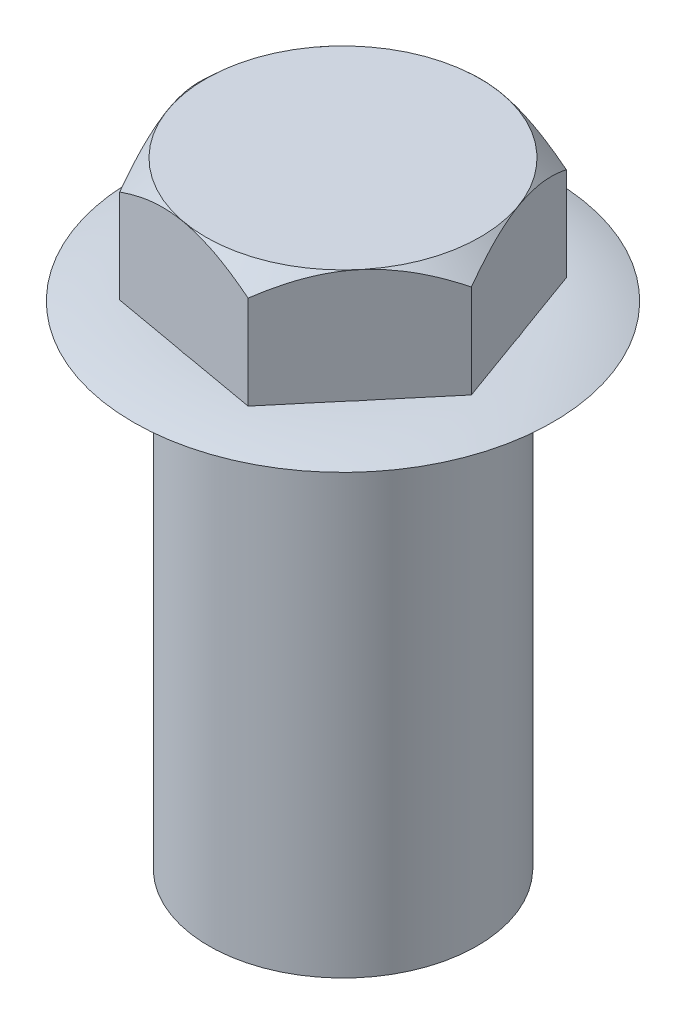
ISO-10303-21;
HEADER;
FILE_DESCRIPTION(('STEP AP214'),'2;1');
FILE_NAME('part.step','',(''),(''),'','','');
FILE_SCHEMA(('AUTOMOTIVE_DESIGN { 1 0 10303 214 1 1 1 1 }'));
ENDSEC;
DATA;
#1=APPLICATION_CONTEXT('core data for automotive mechanical design processes');
#2=APPLICATION_PROTOCOL_DEFINITION('international standard','automotive_design',2000,#1);
#3=PRODUCT_CONTEXT('',#1,'mechanical');
#4=PRODUCT('Part','Part','',(#3));
#5=PRODUCT_RELATED_PRODUCT_CATEGORY('part','',(#4));
#6=PRODUCT_DEFINITION_FORMATION('','',#4);
#7=PRODUCT_DEFINITION_CONTEXT('part definition',#1,'design');
#8=PRODUCT_DEFINITION('design','',#6,#7);
#9=PRODUCT_DEFINITION_SHAPE('','',#8);
#10=(LENGTH_UNIT() NAMED_UNIT(*) SI_UNIT(.MILLI.,.METRE.));
#11=(NAMED_UNIT(*) PLANE_ANGLE_UNIT() SI_UNIT($,.RADIAN.));
#12=(NAMED_UNIT(*) SI_UNIT($,.STERADIAN.) SOLID_ANGLE_UNIT());
#13=UNCERTAINTY_MEASURE_WITH_UNIT(LENGTH_MEASURE(1.E-05),#10,'distance_accuracy_value','');
#14=(GEOMETRIC_REPRESENTATION_CONTEXT(3) GLOBAL_UNCERTAINTY_ASSIGNED_CONTEXT((#13)) GLOBAL_UNIT_ASSIGNED_CONTEXT((#10,
#11,#12)) REPRESENTATION_CONTEXT('',''));
#15=CARTESIAN_POINT('',(0.,0.,0.));
#16=DIRECTION('',(0.,0.,1.));
#17=DIRECTION('',(1.,0.,0.));
#18=AXIS2_PLACEMENT_3D('',#15,#16,#17);
#19=CARTESIAN_POINT('',(0.,3.67723366511614,0.));
#20=DIRECTION('',(0.,-1.,0.));
#21=DIRECTION('',(0.,0.,-1.));
#22=AXIS2_PLACEMENT_3D('',#19,#20,#21);
#23=DEGENERATE_TOROIDAL_SURFACE('',#22,1.87323034856653,2.96330867200839,.T.);
#24=CARTESIAN_POINT('',(0.,6.5,0.));
#25=DIRECTION('',(0.,-1.,0.));
#26=DIRECTION('',(0.,0.,-1.));
#27=AXIS2_PLACEMENT_3D('',#24,#25,#26);
#28=CIRCLE('',#27,2.775);
#29=CARTESIAN_POINT('',(0.,6.5,-2.775));
#30=VERTEX_POINT('',#29);
#31=EDGE_CURVE('E549',#30,#30,#28,.T.);
#32=ORIENTED_EDGE('',*,*,#31,.F.);
#33=EDGE_LOOP('',(#32));
#34=FACE_BOUND('',#33,.T.);
#35=CARTESIAN_POINT('',(1.92782300433998,6.64003894318649,-0.00996338560430932));
#36=DIRECTION('',(-0.341052769256886,0.,-0.940044152464239));
#37=VECTOR('',#36,1.);
#38=LINE('',#35,#37);
#39=CARTESIAN_POINT('',(1.92782300433998,6.64003894318649,-0.0099633856043091));
#40=VERTEX_POINT('',#39);
#41=CARTESIAN_POINT('',(1.74224246655149,6.64003894318649,-0.5214792420489));
#42=VERTEX_POINT('',#41);
#43=EDGE_CURVE('E612',#40,#42,#38,.T.);
#44=ORIENTED_EDGE('',*,*,#43,.F.);
#45=CARTESIAN_POINT('',(0.,6.64003894318649,0.));
#46=DIRECTION('',(0.,1.,0.));
#47=DIRECTION('',(0.,0.,1.));
#48=AXIS2_PLACEMENT_3D('',#45,#46,#47);
#49=CIRCLE('',#48,1.92784875058059);
#50=CARTESIAN_POINT('',(1.80677296856003,6.64003894318649,0.672437539996015));
#51=VERTEX_POINT('',#50);
#52=EDGE_CURVE('E532',#40,#51,#49,.F.);
#53=ORIENTED_EDGE('',*,*,#52,.T.);
#54=CARTESIAN_POINT('',(1.45657751133471,6.64003894318649,1.08891292839112));
#55=CARTESIAN_POINT('',(1.75587092742887,6.640529123798,0.732973583262172));
#56=CARTESIAN_POINT('',(1.80677296856003,6.64003894318649,0.672437539996016));
#57=B_SPLINE_CURVE_WITH_KNOTS('',2,(#54,#55,#56),.UNSPECIFIED.,.F.,.F.,(3,3),(0.,1.),.UNSPECIFIED.);
#58=CARTESIAN_POINT('',(1.45657751133471,6.64003894318649,1.08891292839111));
#59=VERTEX_POINT('',#58);
#60=EDGE_CURVE('E397',#59,#51,#57,.T.);
#61=ORIENTED_EDGE('',*,*,#60,.F.);
#62=CARTESIAN_POINT('',(1.45657751133471,6.64003894318649,1.08891292839111));
#63=CARTESIAN_POINT('',(1.45138626938697,6.64003894318649,1.09585696804593));
#64=CARTESIAN_POINT('',(1.44614536320579,6.64003894318649,1.10276387941191));
#65=CARTESIAN_POINT('',(1.43556531022953,6.64003894318649,1.11650204498342));
#66=CARTESIAN_POINT('',(1.43022616343446,6.64003894318649,1.12333329918895));
#67=CARTESIAN_POINT('',(1.41945071708341,6.64003894318649,1.13691874985676));
#68=CARTESIAN_POINT('',(1.41401441752743,6.64003894318649,1.14367294631905));
#69=CARTESIAN_POINT('',(1.40304577878818,6.64003894318649,1.15710290084807));
#70=CARTESIAN_POINT('',(1.39751343960489,6.64003894318649,1.16377865891482));
#71=CARTESIAN_POINT('',(1.38635385285059,6.64003894318649,1.17705037084578));
#72=CARTESIAN_POINT('',(1.38072660527956,6.64003894318649,1.18364632471001));
#73=CARTESIAN_POINT('',(1.36937835314849,6.64003894318649,1.19675707937988));
#74=CARTESIAN_POINT('',(1.36365734858843,6.64003894318649,1.20327188018553));
#75=CARTESIAN_POINT('',(1.35212275161042,6.64003894318649,1.21621899517177));
#76=CARTESIAN_POINT('',(1.34630915919247,6.64003894318649,1.22265130935236));
#77=CARTESIAN_POINT('',(1.33459057960325,6.64003894318649,1.23543213900703));
#78=CARTESIAN_POINT('',(1.32868559243198,6.64003894318649,1.24178065448111));
#79=CARTESIAN_POINT('',(1.32273550443635,6.64003894318649,1.24808661456121));
#80=B_SPLINE_CURVE_WITH_KNOTS('',3,(#62,#63,#64,#65,#66,#67,#68,#69,#70,#71,#72,#73,#74,#75,#76,
#77,#78,#79),.UNSPECIFIED.,.F.,.F.,(4,2,2,2,2,2,2,2,4),(0.,0.026009740014726,0.0520194800294519,
0.0780292200441786,0.104038960058904,0.13004870007363,0.156058440088357,0.182068180103082,
0.208077920117809),.UNSPECIFIED.);
#81=CARTESIAN_POINT('',(1.32273550443635,6.64003894318649,1.24808661456121));
#82=VERTEX_POINT('',#81);
#83=EDGE_CURVE('E422',#59,#82,#80,.T.);
#84=ORIENTED_EDGE('',*,*,#83,.T.);
#85=CARTESIAN_POINT('',(0.972540047211023,6.64003894318649,1.66456200295631));
#86=CARTESIAN_POINT('',(1.04741637201619,6.64075999330286,1.57551417034903));
#87=CARTESIAN_POINT('',(1.18265732154622,6.64039723773746,1.41467676991925));
#88=CARTESIAN_POINT('',(1.30604243219597,6.64006628298055,1.26793911007872));
#89=CARTESIAN_POINT('',(1.32273550443635,6.64003894318649,1.24808661456121));
#90=B_SPLINE_CURVE_WITH_KNOTS('',2,(#85,#86,#87,#88,#89),.UNSPECIFIED.,.F.,.F.,(3,2,3),(0.,0.6,
1.),.UNSPECIFIED.);
#91=CARTESIAN_POINT('',(0.972540047211023,6.64003894318649,1.66456200295631));
#92=VERTEX_POINT('',#91);
#93=EDGE_CURVE('E65',#92,#82,#90,.T.);
#94=ORIENTED_EDGE('',*,*,#93,.F.);
#95=CARTESIAN_POINT('',(0.321038492185153,6.64003894318649,1.90093005964202));
#96=VERTEX_POINT('',#95);
#97=EDGE_CURVE('E517',#92,#96,#49,.F.);
#98=ORIENTED_EDGE('',*,*,#97,.T.);
#99=CARTESIAN_POINT('',(-0.214737502828659,6.64003894318649,1.80588959159253));
#100=DIRECTION('',(0.984628501341486,0.,0.174661714024623));
#101=VECTOR('',#100,1.);
#102=LINE('',#99,#101);
#103=CARTESIAN_POINT('',(-0.21473750282866,6.64003894318649,1.80588959159253));
#104=VERTEX_POINT('',#103);
#105=EDGE_CURVE('E219',#104,#96,#102,.T.);
#106=ORIENTED_EDGE('',*,*,#105,.F.);
#107=CARTESIAN_POINT('',(-0.214737502828658,6.64003894318649,1.80588959159253));
#108=CARTESIAN_POINT('',(-0.223346838548484,6.64003894318649,1.80486586401601));
#109=CARTESIAN_POINT('',(-0.231948852343703,6.64003894318649,1.80378056180724));
#110=CARTESIAN_POINT('',(-0.249136479218154,6.64003894318649,1.80148704994217));
#111=CARTESIAN_POINT('',(-0.257722092297386,6.64003894318649,1.80027884028587));
#112=CARTESIAN_POINT('',(-0.274875160873096,6.64003894318649,1.79773975534265));
#113=CARTESIAN_POINT('',(-0.283442616369574,6.64003894318649,1.79640888005574));
#114=CARTESIAN_POINT('',(-0.30055761753301,6.64003894318649,1.79362473752712));
#115=CARTESIAN_POINT('',(-0.309105163199969,6.64003894318649,1.79217147028541));
#116=CARTESIAN_POINT('',(-0.326178596261048,6.64003894318649,1.78914284062593));
#117=CARTESIAN_POINT('',(-0.334704483655169,6.64003894318649,1.78756747820816));
#118=CARTESIAN_POINT('',(-0.351732856327603,6.64003894318649,1.78429498090903));
#119=CARTESIAN_POINT('',(-0.360235341605916,6.64003894318649,1.78259784602768));
#120=CARTESIAN_POINT('',(-0.377215170578719,6.64003894318649,1.77908214951543));
#121=CARTESIAN_POINT('',(-0.385692514273208,6.64003894318649,1.77726358788453));
#122=CARTESIAN_POINT('',(-0.402620327230204,6.64003894318649,1.77350541509133));
#123=CARTESIAN_POINT('',(-0.41107079649271,6.64003894318649,1.77156580392903));
#124=CARTESIAN_POINT('',(-0.419506962115144,6.64003894318649,1.7695658566101));
#125=B_SPLINE_CURVE_WITH_KNOTS('',3,(#107,#108,#109,#110,#111,#112,#113,#114,#115,#116,#117,
#118,#119,#120,#121,#122,#123,#124),.UNSPECIFIED.,.F.,.F.,(4,2,2,2,2,2,2,2,4),(0.,
0.0260097400147251,0.0520194800294503,0.0780292200441754,0.1040389600589,0.130048700073626,
0.156058440088351,0.182068180103076,0.208077920117801),.UNSPECIFIED.);
#126=CARTESIAN_POINT('',(-0.419506962115145,6.64003894318649,1.7695658566101));
#127=VERTEX_POINT('',#126);
#128=EDGE_CURVE('E412',#104,#127,#125,.T.);
#129=ORIENTED_EDGE('',*,*,#128,.T.);
#130=CARTESIAN_POINT('',(-0.955282957128957,6.64003894318649,1.67452538856062));
#131=CARTESIAN_POINT('',(-0.840726659788333,6.64075999613371,1.6948463514604));
#132=CARTESIAN_POINT('',(-0.633814012261697,6.64039723186794,1.73155026326179));
#133=CARTESIAN_POINT('',(-0.445051100208068,6.64006628815804,1.76503462179767));
#134=CARTESIAN_POINT('',(-0.419506962115145,6.64003894318649,1.7695658566101));
#135=B_SPLINE_CURVE_WITH_KNOTS('',2,(#130,#131,#132,#133,#134),.UNSPECIFIED.,.F.,.F.,(3,2,3),
(0.,0.6,1.),.UNSPECIFIED.);
#136=CARTESIAN_POINT('',(-0.955282957128957,6.64003894318649,1.67452538856062));
#137=VERTEX_POINT('',#136);
#138=EDGE_CURVE('E410',#137,#127,#135,.T.);
#139=ORIENTED_EDGE('',*,*,#138,.F.);
#140=CARTESIAN_POINT('',(-1.48573447637488,6.64003894318649,1.22849251964601));
#141=VERTEX_POINT('',#140);
#142=EDGE_CURVE('E11',#137,#141,#49,.F.);
#143=ORIENTED_EDGE('',*,*,#142,.T.);
#144=CARTESIAN_POINT('',(-1.67131501416336,6.64003894318649,0.716976663201422));
#145=CARTESIAN_POINT('',(-1.51270920712239,6.640529123798,1.15414203728886));
#146=CARTESIAN_POINT('',(-1.48573447637488,6.64003894318649,1.22849251964601));
#147=B_SPLINE_CURVE_WITH_KNOTS('',2,(#144,#145,#146),.UNSPECIFIED.,.F.,.F.,(3,3),(0.,1.),.UNSPECIFIED.);
#148=CARTESIAN_POINT('',(-1.67131501416336,6.64003894318649,0.716976663201421));
#149=VERTEX_POINT('',#148);
#150=EDGE_CURVE('E417',#149,#141,#147,.T.);
#151=ORIENTED_EDGE('',*,*,#150,.F.);
#152=CARTESIAN_POINT('',(-1.67131501416336,6.64003894318649,0.716976663201422));
#153=CARTESIAN_POINT('',(-1.67473310793545,6.64003894318649,0.709008895970081));
#154=CARTESIAN_POINT('',(-1.67809421554949,6.64003894318649,0.701016682395335));
#155=CARTESIAN_POINT('',(-1.68470178944768,6.64003894318649,0.684985004958756));
#156=CARTESIAN_POINT('',(-1.68794825573184,6.64003894318649,0.676945541096923));
#157=CARTESIAN_POINT('',(-1.6943258779565,6.64003894318649,0.660821005485891));
#158=CARTESIAN_POINT('',(-1.69745703389701,6.64003894318649,0.652735933736692));
#159=CARTESIAN_POINT('',(-1.70360339632119,6.64003894318649,0.636521836679046));
#160=CARTESIAN_POINT('',(-1.70661860280486,6.64003894318649,0.628392811370598));
#161=CARTESIAN_POINT('',(-1.71253244911164,6.64003894318649,0.612092469780149));
#162=CARTESIAN_POINT('',(-1.71543108893474,6.64003894318649,0.603921153498147));
#163=CARTESIAN_POINT('',(-1.72111120947609,6.64003894318649,0.587537901529146));
#164=CARTESIAN_POINT('',(-1.72389269019435,6.64003894318649,0.579325965842147));
#165=CARTESIAN_POINT('',(-1.72933792218915,6.64003894318649,0.562863154343657));
#166=CARTESIAN_POINT('',(-1.73200167346568,6.64003894318649,0.554612278532166));
#167=CARTESIAN_POINT('',(-1.73721090683346,6.64003894318649,0.538073276084296));
#168=CARTESIAN_POINT('',(-1.7397563889247,6.64003894318649,0.529785149447916));
#169=CARTESIAN_POINT('',(-1.7422424665515,6.64003894318649,0.521479242048893));
#170=B_SPLINE_CURVE_WITH_KNOTS('',3,(#152,#153,#154,#155,#156,#157,#158,#159,#160,#161,#162,
#163,#164,#165,#166,#167,#168,#169),.UNSPECIFIED.,.F.,.F.,(4,2,2,2,2,2,2,2,4),(0.,
0.0260097400147267,0.0520194800294534,0.0780292200441817,0.104038960058908,0.130048700073635,
0.156058440088364,0.18206818010309,0.208077920117817),.UNSPECIFIED.);
#171=CARTESIAN_POINT('',(-1.7422424665515,6.64003894318649,0.521479242048892));
#172=VERTEX_POINT('',#171);
#173=EDGE_CURVE('E265',#149,#172,#170,.T.);
#174=ORIENTED_EDGE('',*,*,#173,.T.);
#175=CARTESIAN_POINT('',(-1.92782300433998,6.64003894318649,0.0099633856043084));
#176=DIRECTION('',(0.341052769256886,0.,0.940044152464239));
#177=VECTOR('',#176,1.);
#178=LINE('',#175,#177);
#179=CARTESIAN_POINT('',(-1.92782300433998,6.64003894318649,0.00996338560430845));
#180=VERTEX_POINT('',#179);
#181=EDGE_CURVE('E578',#180,#172,#178,.T.);
#182=ORIENTED_EDGE('',*,*,#181,.F.);
#183=CARTESIAN_POINT('',(-1.80677296856003,6.64003894318649,-0.672437539996014));
#184=VERTEX_POINT('',#183);
#185=EDGE_CURVE('E49',#180,#184,#49,.F.);
#186=ORIENTED_EDGE('',*,*,#185,.T.);
#187=CARTESIAN_POINT('',(-1.45657751133471,6.64003894318649,-1.08891292839111));
#188=CARTESIAN_POINT('',(-1.75587092742887,6.640529123798,-0.73297358326217));
#189=CARTESIAN_POINT('',(-1.80677296856003,6.64003894318649,-0.672437539996014));
#190=B_SPLINE_CURVE_WITH_KNOTS('',2,(#187,#188,#189),.UNSPECIFIED.,.F.,.F.,(3,3),(0.,1.),.UNSPECIFIED.);
#191=CARTESIAN_POINT('',(-1.45657751133471,6.64003894318649,-1.08891292839111));
#192=VERTEX_POINT('',#191);
#193=EDGE_CURVE('E564',#192,#184,#190,.T.);
#194=ORIENTED_EDGE('',*,*,#193,.F.);
#195=CARTESIAN_POINT('',(-1.45657751133471,6.64003894318649,-1.08891292839111));
#196=CARTESIAN_POINT('',(-1.45138626938698,6.64003894318649,-1.09585696804593));
#197=CARTESIAN_POINT('',(-1.44614536320579,6.64003894318649,-1.10276387941191));
#198=CARTESIAN_POINT('',(-1.43556531022953,6.64003894318649,-1.11650204498342));
#199=CARTESIAN_POINT('',(-1.43022616343446,6.64003894318649,-1.12333329918894));
#200=CARTESIAN_POINT('',(-1.41945071708341,6.64003894318649,-1.13691874985676));
#201=CARTESIAN_POINT('',(-1.41401441752744,6.64003894318649,-1.14367294631904));
#202=CARTESIAN_POINT('',(-1.40304577878818,6.64003894318649,-1.15710290084807));
#203=CARTESIAN_POINT('',(-1.39751343960489,6.64003894318649,-1.16377865891481));
#204=CARTESIAN_POINT('',(-1.38635385285059,6.64003894318649,-1.17705037084578));
#205=CARTESIAN_POINT('',(-1.38072660527957,6.64003894318649,-1.18364632471001));
#206=CARTESIAN_POINT('',(-1.36937835314849,6.64003894318649,-1.19675707937988));
#207=CARTESIAN_POINT('',(-1.36365734858843,6.64003894318649,-1.20327188018553));
#208=CARTESIAN_POINT('',(-1.35212275161042,6.64003894318649,-1.21621899517177));
#209=CARTESIAN_POINT('',(-1.34630915919247,6.64003894318649,-1.22265130935236));
#210=CARTESIAN_POINT('',(-1.33459057960325,6.64003894318649,-1.23543213900703));
#211=CARTESIAN_POINT('',(-1.32868559243198,6.64003894318649,-1.24178065448111));
#212=CARTESIAN_POINT('',(-1.32273550443634,6.64003894318649,-1.24808661456121));
#213=B_SPLINE_CURVE_WITH_KNOTS('',3,(#195,#196,#197,#198,#199,#200,#201,#202,#203,#204,#205,
#206,#207,#208,#209,#210,#211,#212),.UNSPECIFIED.,.F.,.F.,(4,2,2,2,2,2,2,2,4),(0.,
0.0260097400147268,0.0520194800294533,0.0780292200441817,0.104038960058909,0.130048700073635,
0.156058440088364,0.18206818010309,0.208077920117817),.UNSPECIFIED.);
#214=CARTESIAN_POINT('',(-1.32273550443634,6.64003894318649,-1.24808661456121));
#215=VERTEX_POINT('',#214);
#216=EDGE_CURVE('E278',#192,#215,#213,.T.);
#217=ORIENTED_EDGE('',*,*,#216,.T.);
#218=CARTESIAN_POINT('',(-0.972540047211022,6.64003894318649,-1.66456200295631));
#219=CARTESIAN_POINT('',(-1.04741637201619,6.64075999330286,-1.57551417034903));
#220=CARTESIAN_POINT('',(-1.18265732154621,6.64039723773746,-1.41467676991925));
#221=CARTESIAN_POINT('',(-1.30604243219596,6.64006628298055,-1.26793911007873));
#222=CARTESIAN_POINT('',(-1.32273550443634,6.64003894318649,-1.24808661456121));
#223=B_SPLINE_CURVE_WITH_KNOTS('',2,(#218,#219,#220,#221,#222),.UNSPECIFIED.,.F.,.F.,(3,2,3),
(0.,0.6,1.),.UNSPECIFIED.);
#224=CARTESIAN_POINT('',(-0.972540047211022,6.64003894318649,-1.66456200295631));
#225=VERTEX_POINT('',#224);
#226=EDGE_CURVE('E566',#225,#215,#223,.T.);
#227=ORIENTED_EDGE('',*,*,#226,.F.);
#228=CARTESIAN_POINT('',(-0.321038492185154,6.64003894318649,-1.90093005964202));
#229=VERTEX_POINT('',#228);
#230=EDGE_CURVE('E528',#225,#229,#49,.F.);
#231=ORIENTED_EDGE('',*,*,#230,.T.);
#232=CARTESIAN_POINT('',(0.214737502828653,6.64003894318649,-1.80588959159253));
#233=DIRECTION('',(-0.984628501341486,0.,-0.174661714024624));
#234=VECTOR('',#233,1.);
#235=LINE('',#232,#234);
#236=CARTESIAN_POINT('',(0.214737502828653,6.64003894318649,-1.80588959159253));
#237=VERTEX_POINT('',#236);
#238=EDGE_CURVE('E349',#237,#229,#235,.T.);
#239=ORIENTED_EDGE('',*,*,#238,.F.);
#240=CARTESIAN_POINT('',(0.214737502828652,6.64003894318649,-1.80588959159253));
#241=CARTESIAN_POINT('',(0.223346838548479,6.64003894318649,-1.80486586401601));
#242=CARTESIAN_POINT('',(0.231948852343698,6.64003894318649,-1.80378056180724));
#243=CARTESIAN_POINT('',(0.24913647921815,6.64003894318649,-1.80148704994217));
#244=CARTESIAN_POINT('',(0.257722092297384,6.64003894318649,-1.80027884028587));
#245=CARTESIAN_POINT('',(0.274875160873095,6.64003894318649,-1.79773975534265));
#246=CARTESIAN_POINT('',(0.283442616369573,6.64003894318649,-1.79640888005574));
#247=CARTESIAN_POINT('',(0.300557617533011,6.64003894318649,-1.79362473752712));
#248=CARTESIAN_POINT('',(0.30910516319997,6.64003894318649,-1.79217147028541));
#249=CARTESIAN_POINT('',(0.326178596261051,6.64003894318649,-1.78914284062593));
#250=CARTESIAN_POINT('',(0.334704483655173,6.64003894318649,-1.78756747820816));
#251=CARTESIAN_POINT('',(0.351732856327608,6.64003894318649,-1.78429498090903));
#252=CARTESIAN_POINT('',(0.360235341605922,6.64003894318649,-1.78259784602768));
#253=CARTESIAN_POINT('',(0.377215170578725,6.64003894318649,-1.77908214951543));
#254=CARTESIAN_POINT('',(0.385692514273215,6.64003894318649,-1.77726358788452));
#255=CARTESIAN_POINT('',(0.402620327230212,6.64003894318649,-1.77350541509133));
#256=CARTESIAN_POINT('',(0.411070796492719,6.64003894318649,-1.77156580392903));
#257=CARTESIAN_POINT('',(0.419506962115154,6.64003894318649,-1.7695658566101));
#258=B_SPLINE_CURVE_WITH_KNOTS('',3,(#240,#241,#242,#243,#244,#245,#246,#247,#248,#249,#250,
#251,#252,#253,#254,#255,#256,#257),.UNSPECIFIED.,.F.,.F.,(4,2,2,2,2,2,2,2,4),(0.,
0.0260097400147271,0.0520194800294543,0.0780292200441814,0.104038960058909,0.130048700073636,
0.156058440088363,0.18206818010309,0.208077920117817),.UNSPECIFIED.);
#259=CARTESIAN_POINT('',(0.419506962115154,6.64003894318649,-1.7695658566101));
#260=VERTEX_POINT('',#259);
#261=EDGE_CURVE('E458',#237,#260,#258,.T.);
#262=ORIENTED_EDGE('',*,*,#261,.T.);
#263=CARTESIAN_POINT('',(0.95528295712896,6.64003894318649,-1.67452538856062));
#264=CARTESIAN_POINT('',(0.840726659788337,6.64075999613371,-1.6948463514604));
#265=CARTESIAN_POINT('',(0.633814012261703,6.64039723186794,-1.73155026326179));
#266=CARTESIAN_POINT('',(0.445051100208069,6.64006628815804,-1.76503462179767));
#267=CARTESIAN_POINT('',(0.419506962115154,6.64003894318649,-1.7695658566101));
#268=B_SPLINE_CURVE_WITH_KNOTS('',2,(#263,#264,#265,#266,#267),.UNSPECIFIED.,.F.,.F.,(3,2,3),
(0.,0.6,1.),.UNSPECIFIED.);
#269=CARTESIAN_POINT('',(0.95528295712896,6.64003894318649,-1.67452538856062));
#270=VERTEX_POINT('',#269);
#271=EDGE_CURVE('E337',#270,#260,#268,.T.);
#272=ORIENTED_EDGE('',*,*,#271,.F.);
#273=CARTESIAN_POINT('',(1.48573447637488,6.64003894318649,-1.228492519646));
#274=VERTEX_POINT('',#273);
#275=EDGE_CURVE('E535',#270,#274,#49,.F.);
#276=ORIENTED_EDGE('',*,*,#275,.T.);
#277=CARTESIAN_POINT('',(1.67131501416337,6.64003894318649,-0.716976663201414));
#278=CARTESIAN_POINT('',(1.51270920712239,6.640529123798,-1.15414203728886));
#279=CARTESIAN_POINT('',(1.48573447637488,6.64003894318649,-1.22849251964601));
#280=B_SPLINE_CURVE_WITH_KNOTS('',2,(#277,#278,#279),.UNSPECIFIED.,.F.,.F.,(3,3),(0.,1.),.UNSPECIFIED.);
#281=CARTESIAN_POINT('',(1.67131501416337,6.64003894318649,-0.716976663201414));
#282=VERTEX_POINT('',#281);
#283=EDGE_CURVE('E352',#282,#274,#280,.T.);
#284=ORIENTED_EDGE('',*,*,#283,.F.);
#285=CARTESIAN_POINT('',(1.67131501416337,6.64003894318649,-0.716976663201414));
#286=CARTESIAN_POINT('',(1.67473310793546,6.64003894318649,-0.709008895970073));
#287=CARTESIAN_POINT('',(1.67809421554949,6.64003894318649,-0.701016682395328));
#288=CARTESIAN_POINT('',(1.68470178944768,6.64003894318649,-0.684985004958749));
#289=CARTESIAN_POINT('',(1.68794825573184,6.64003894318649,-0.676945541096917));
#290=CARTESIAN_POINT('',(1.6943258779565,6.64003894318649,-0.660821005485886));
#291=CARTESIAN_POINT('',(1.69745703389701,6.64003894318649,-0.652735933736689));
#292=CARTESIAN_POINT('',(1.70360339632119,6.64003894318649,-0.636521836679044));
#293=CARTESIAN_POINT('',(1.70661860280486,6.64003894318649,-0.628392811370597));
#294=CARTESIAN_POINT('',(1.71253244911164,6.64003894318649,-0.612092469780148));
#295=CARTESIAN_POINT('',(1.71543108893474,6.64003894318649,-0.603921153498147));
#296=CARTESIAN_POINT('',(1.72111120947609,6.64003894318649,-0.587537901529148));
#297=CARTESIAN_POINT('',(1.72389269019435,6.64003894318649,-0.579325965842149));
#298=CARTESIAN_POINT('',(1.72933792218914,6.64003894318649,-0.562863154343661));
#299=CARTESIAN_POINT('',(1.73200167346568,6.64003894318649,-0.554612278532171));
#300=CARTESIAN_POINT('',(1.73721090683346,6.64003894318649,-0.538073276084302));
#301=CARTESIAN_POINT('',(1.7397563889247,6.64003894318649,-0.529785149447923));
#302=CARTESIAN_POINT('',(1.74224246655149,6.64003894318649,-0.5214792420489));
#303=B_SPLINE_CURVE_WITH_KNOTS('',3,(#285,#286,#287,#288,#289,#290,#291,#292,#293,#294,#295,
#296,#297,#298,#299,#300,#301,#302),.UNSPECIFIED.,.F.,.F.,(4,2,2,2,2,2,2,2,4),(0.,
0.0260097400147251,0.0520194800294502,0.0780292200441754,0.104038960058901,0.130048700073625,
0.156058440088351,0.182068180103075,0.208077920117801),.UNSPECIFIED.);
#304=EDGE_CURVE('E469',#282,#42,#303,.T.);
#305=ORIENTED_EDGE('',*,*,#304,.T.);
#306=EDGE_LOOP('',(#44,#53,#61,#84,#94,#98,#106,#129,#139,#143,#151,#174,#182,#186,#194,#217,
#227,#231,#239,#262,#272,#276,#284,#305));
#307=FACE_BOUND('',#306,.T.);
#308=ADVANCED_FACE('F39',(#34,#307),#23,.T.);
#309=CARTESIAN_POINT('',(0.,0.,0.));
#310=DIRECTION('',(0.,-1.,0.));
#311=DIRECTION('',(0.,0.,-1.));
#312=AXIS2_PLACEMENT_3D('',#309,#310,#311);
#313=PLANE('',#312);
#314=CARTESIAN_POINT('',(0.,0.,0.));
#315=DIRECTION('',(0.,-1.,0.));
#316=DIRECTION('',(0.,0.,-1.));
#317=AXIS2_PLACEMENT_3D('',#314,#315,#316);
#318=CIRCLE('',#317,1.775);
#319=CARTESIAN_POINT('',(0.,0.,-1.775));
#320=VERTEX_POINT('',#319);
#321=EDGE_CURVE('E540',#320,#320,#318,.T.);
#322=ORIENTED_EDGE('',*,*,#321,.T.);
#323=EDGE_LOOP('',(#322));
#324=FACE_BOUND('',#323,.T.);
#325=ADVANCED_FACE('F41',(#324),#313,.T.);
#326=CARTESIAN_POINT('',(0.,0.,0.));
#327=DIRECTION('',(0.,-1.,0.));
#328=DIRECTION('',(0.,0.,-1.));
#329=AXIS2_PLACEMENT_3D('',#326,#327,#328);
#330=CYLINDRICAL_SURFACE('',#329,1.775);
#331=CARTESIAN_POINT('',(0.,6.5,0.));
#332=DIRECTION('',(0.,-1.,0.));
#333=DIRECTION('',(0.,0.,-1.));
#334=AXIS2_PLACEMENT_3D('',#331,#332,#333);
#335=CIRCLE('',#334,1.775);
#336=CARTESIAN_POINT('',(0.,6.5,-1.775));
#337=VERTEX_POINT('',#336);
#338=EDGE_CURVE('E543',#337,#337,#335,.T.);
#339=ORIENTED_EDGE('',*,*,#338,.T.);
#340=EDGE_LOOP('',(#339));
#341=FACE_BOUND('',#340,.T.);
#342=ORIENTED_EDGE('',*,*,#321,.F.);
#343=EDGE_LOOP('',(#342));
#344=FACE_BOUND('',#343,.T.);
#345=ADVANCED_FACE('F727',(#341,#344),#330,.T.);
#346=CARTESIAN_POINT('',(1.775,6.5,0.));
#347=DIRECTION('',(0.,-1.,0.));
#348=DIRECTION('',(0.,0.,-1.));
#349=AXIS2_PLACEMENT_3D('',#346,#347,#348);
#350=PLANE('',#349);
#351=ORIENTED_EDGE('',*,*,#31,.T.);
#352=EDGE_LOOP('',(#351));
#353=FACE_BOUND('',#352,.T.);
#354=ORIENTED_EDGE('',*,*,#338,.F.);
#355=EDGE_LOOP('',(#354));
#356=FACE_BOUND('',#355,.T.);
#357=ADVANCED_FACE('F731',(#353,#356),#350,.T.);
#358=CARTESIAN_POINT('',(0.,6.64003894318649,0.));
#359=DIRECTION('',(0.,1.,0.));
#360=DIRECTION('',(0.,0.,1.));
#361=AXIS2_PLACEMENT_3D('',#358,#359,#360);
#362=PLANE('',#361);
#363=ORIENTED_EDGE('',*,*,#142,.F.);
#364=DIRECTION('',(0.984628501341486,0.,0.174661714024623));
#365=VECTOR('',#364,1.);
#366=CARTESIAN_POINT('',(-1.34926731521956,6.64003894318649,1.60463711781765));
#367=LINE('',#366,#365);
#368=CARTESIAN_POINT('',(-1.34926731521956,6.64003894318649,1.60463711781765));
#369=VERTEX_POINT('',#368);
#370=EDGE_CURVE('E407',#369,#137,#367,.T.);
#371=ORIENTED_EDGE('',*,*,#370,.F.);
#372=DIRECTION('',(0.341052769256886,0.,0.940044152464239));
#373=VECTOR('',#372,1.);
#374=CARTESIAN_POINT('',(-2.06429016549531,6.64003894318649,-0.366181212567336));
#375=LINE('',#374,#373);
#376=EDGE_CURVE('E320',#141,#369,#375,.T.);
#377=ORIENTED_EDGE('',*,*,#376,.F.);
#378=EDGE_LOOP('',(#363,#371,#377));
#379=FACE_BOUND('',#378,.T.);
#380=ADVANCED_FACE('F576',(#379),#362,.F.);
#381=ORIENTED_EDGE('',*,*,#185,.F.);
#382=CARTESIAN_POINT('',(-2.06429016549531,6.64003894318649,-0.366181212567336));
#383=VERTEX_POINT('',#382);
#384=EDGE_CURVE('E580',#383,#180,#375,.T.);
#385=ORIENTED_EDGE('',*,*,#384,.F.);
#386=DIRECTION('',(-0.6435757320846,0.,0.765382438439615));
#387=VECTOR('',#386,1.);
#388=CARTESIAN_POINT('',(-0.71502285027575,6.64003894318649,-1.97081833038499));
#389=LINE('',#388,#387);
#390=EDGE_CURVE('E321',#184,#383,#389,.T.);
#391=ORIENTED_EDGE('',*,*,#390,.F.);
#392=EDGE_LOOP('',(#381,#385,#391));
#393=FACE_BOUND('',#392,.T.);
#394=ADVANCED_FACE('F641',(#393),#362,.F.);
#395=ORIENTED_EDGE('',*,*,#230,.F.);
#396=CARTESIAN_POINT('',(-0.71502285027575,6.64003894318649,-1.97081833038499));
#397=VERTEX_POINT('',#396);
#398=EDGE_CURVE('E311',#397,#225,#389,.T.);
#399=ORIENTED_EDGE('',*,*,#398,.F.);
#400=DIRECTION('',(-0.984628501341486,0.,-0.174661714024624));
#401=VECTOR('',#400,1.);
#402=CARTESIAN_POINT('',(1.34926731521956,6.64003894318649,-1.60463711781765));
#403=LINE('',#402,#401);
#404=EDGE_CURVE('E604',#229,#397,#403,.T.);
#405=ORIENTED_EDGE('',*,*,#404,.F.);
#406=EDGE_LOOP('',(#395,#399,#405));
#407=FACE_BOUND('',#406,.T.);
#408=ADVANCED_FACE('F715',(#407),#362,.F.);
#409=ORIENTED_EDGE('',*,*,#275,.F.);
#410=CARTESIAN_POINT('',(1.34926731521956,6.64003894318649,-1.60463711781765));
#411=VERTEX_POINT('',#410);
#412=EDGE_CURVE('E332',#411,#270,#403,.T.);
#413=ORIENTED_EDGE('',*,*,#412,.F.);
#414=DIRECTION('',(-0.341052769256886,0.,-0.940044152464239));
#415=VECTOR('',#414,1.);
#416=CARTESIAN_POINT('',(2.06429016549531,6.64003894318649,0.366181212567336));
#417=LINE('',#416,#415);
#418=EDGE_CURVE('E184',#274,#411,#417,.T.);
#419=ORIENTED_EDGE('',*,*,#418,.F.);
#420=EDGE_LOOP('',(#409,#413,#419));
#421=FACE_BOUND('',#420,.T.);
#422=ADVANCED_FACE('F619',(#421),#362,.F.);
#423=ORIENTED_EDGE('',*,*,#52,.F.);
#424=CARTESIAN_POINT('',(2.06429016549531,6.64003894318649,0.366181212567336));
#425=VERTEX_POINT('',#424);
#426=EDGE_CURVE('E611',#425,#40,#417,.T.);
#427=ORIENTED_EDGE('',*,*,#426,.F.);
#428=DIRECTION('',(0.6435757320846,0.,-0.765382438439615));
#429=VECTOR('',#428,1.);
#430=CARTESIAN_POINT('',(0.715022850275751,6.64003894318649,1.97081833038499));
#431=LINE('',#430,#429);
#432=EDGE_CURVE('E189',#51,#425,#431,.T.);
#433=ORIENTED_EDGE('',*,*,#432,.F.);
#434=EDGE_LOOP('',(#423,#427,#433));
#435=FACE_BOUND('',#434,.T.);
#436=ADVANCED_FACE('F721',(#435),#362,.F.);
#437=ORIENTED_EDGE('',*,*,#97,.F.);
#438=CARTESIAN_POINT('',(0.715022850275751,6.64003894318649,1.97081833038499));
#439=VERTEX_POINT('',#438);
#440=EDGE_CURVE('E193',#439,#92,#431,.T.);
#441=ORIENTED_EDGE('',*,*,#440,.F.);
#442=EDGE_CURVE('E225',#96,#439,#367,.T.);
#443=ORIENTED_EDGE('',*,*,#442,.F.);
#444=EDGE_LOOP('',(#437,#441,#443));
#445=FACE_BOUND('',#444,.T.);
#446=ADVANCED_FACE('F366',(#445),#362,.F.);
#447=CARTESIAN_POINT('',(2.06429016549531,8.14003894318649,0.366181212567336));
#448=DIRECTION('',(-0.940044152464239,0.,0.341052769256886));
#449=DIRECTION('',(0.341052769256886,0.,0.940044152464239));
#450=AXIS2_PLACEMENT_3D('',#447,#448,#449);
#451=PLANE('',#450);
#452=DIRECTION('',(0.,-1.,0.));
#453=VECTOR('',#452,1.);
#454=CARTESIAN_POINT('',(1.34926731521956,8.14003894318649,-1.60463711781765));
#455=LINE('',#454,#453);
#456=CARTESIAN_POINT('',(1.34926731521956,7.87744816051863,-1.60463711781765));
#457=VERTEX_POINT('',#456);
#458=EDGE_CURVE('E182',#457,#411,#455,.T.);
#459=ORIENTED_EDGE('',*,*,#458,.F.);
#460=CARTESIAN_POINT('',(1.34918568408246,7.87733654070205,-1.60486211781765));
#461=CARTESIAN_POINT('',(1.37532192811011,7.91304764740059,-1.53282275740107));
#462=CARTESIAN_POINT('',(1.40187857899708,7.94645616553473,-1.45962462905947));
#463=CARTESIAN_POINT('',(1.45596721398898,8.00703590337528,-1.3105400602706));
#464=CARTESIAN_POINT('',(1.48350377816543,8.03417162267809,-1.2346409957668));
#465=CARTESIAN_POINT('',(1.53890081016928,8.07973020136961,-1.08195009074188));
#466=CARTESIAN_POINT('',(1.56674682342174,8.09829934041082,-1.00519809138279));
#467=CARTESIAN_POINT('',(1.62294464207379,8.12561654648542,-0.85029997716951));
#468=CARTESIAN_POINT('',(1.65129509568946,8.13438773399608,-0.772157588238953));
#469=CARTESIAN_POINT('',(1.70451149793632,8.14074548073478,-0.625477155599892));
#470=CARTESIAN_POINT('',(1.7293598806406,8.13961780189691,-0.556987528876591));
#471=CARTESIAN_POINT('',(1.77887463304464,8.12929970742555,-0.420509958090256));
#472=CARTESIAN_POINT('',(1.80354086298192,8.12010364182341,-0.352522399254704));
#473=CARTESIAN_POINT('',(1.85242810347089,8.09443063418624,-0.217774440304252));
#474=CARTESIAN_POINT('',(1.87664891511223,8.0779505177896,-0.151014588446156));
#475=CARTESIAN_POINT('',(1.92450998653568,8.03886374060224,-0.0190950605082449));
#476=CARTESIAN_POINT('',(1.94814998255705,8.01625435048138,0.0460638885675404));
#477=CARTESIAN_POINT('',(1.98726902207478,7.97421003104304,0.15388774359381));
#478=CARTESIAN_POINT('',(2.00291853676622,7.95610724638157,0.197022519501499));
#479=CARTESIAN_POINT('',(2.03387874689027,7.91804375161307,0.282358183391838));
#480=CARTESIAN_POINT('',(2.04919055855388,7.89809086969322,0.324562148043311));
#481=CARTESIAN_POINT('',(2.06437179663242,7.87733654070221,0.366406212567392));
#482=B_SPLINE_CURVE_WITH_KNOTS('',3,(#460,#461,#462,#463,#464,#465,#466,#467,#468,#469,#470,
#471,#472,#473,#474,#475,#476,#477,#478,#479,#480,#481),.UNSPECIFIED.,.F.,.F.,(4,2,2,2,2,2,2,2,
2,2,4),(0.,0.253820157851563,0.509043421787632,0.759730681330524,1.00982512980793,
1.22796799911914,1.44626374718878,1.66465472165809,1.88314310455875,2.03108496685009,
2.17842717322033),.UNSPECIFIED.);
#483=CARTESIAN_POINT('',(2.06429016549531,7.87744816051863,0.366181212567336));
#484=VERTEX_POINT('',#483);
#485=EDGE_CURVE('E169',#457,#484,#482,.T.);
#486=ORIENTED_EDGE('',*,*,#485,.T.);
#487=DIRECTION('',(0.,-1.,0.));
#488=VECTOR('',#487,1.);
#489=CARTESIAN_POINT('',(2.06429016549531,8.14003894318649,0.366181212567336));
#490=LINE('',#489,#488);
#491=EDGE_CURVE('E179',#484,#425,#490,.T.);
#492=ORIENTED_EDGE('',*,*,#491,.T.);
#493=ORIENTED_EDGE('',*,*,#426,.T.);
#494=ORIENTED_EDGE('',*,*,#43,.T.);
#495=ORIENTED_EDGE('',*,*,#304,.F.);
#496=ORIENTED_EDGE('',*,*,#283,.T.);
#497=ORIENTED_EDGE('',*,*,#418,.T.);
#498=EDGE_LOOP('',(#459,#486,#492,#493,#494,#495,#496,#497));
#499=FACE_BOUND('',#498,.T.);
#500=ADVANCED_FACE('F177',(#499),#451,.F.);
#501=CARTESIAN_POINT('',(1.34926731521956,8.14003894318649,-1.60463711781765));
#502=DIRECTION('',(-0.174661714024624,0.,0.984628501341486));
#503=DIRECTION('',(0.984628501341486,0.,0.174661714024624));
#504=AXIS2_PLACEMENT_3D('',#501,#502,#503);
#505=PLANE('',#504);
#506=DIRECTION('',(0.,-1.,0.));
#507=VECTOR('',#506,1.);
#508=CARTESIAN_POINT('',(-0.71502285027575,8.14003894318649,-1.97081833038499));
#509=LINE('',#508,#507);
#510=CARTESIAN_POINT('',(-0.715022850275751,7.87744816051862,-1.97081833038499));
#511=VERTEX_POINT('',#510);
#512=EDGE_CURVE('E209',#511,#397,#509,.T.);
#513=ORIENTED_EDGE('',*,*,#512,.F.);
#514=CARTESIAN_POINT('',(-0.71524785027575,7.87734159530241,-1.97085824278403));
#515=CARTESIAN_POINT('',(-0.639792473341159,7.91305211463993,-1.95747333116527));
#516=CARTESIAN_POINT('',(-0.563123388007811,7.94646005572343,-1.9438731217068));
#517=CARTESIAN_POINT('',(-0.406969467486823,8.00703869876429,-1.91617322131523));
#518=CARTESIAN_POINT('',(-0.327471410172175,8.03417390178156,-1.90207118492964));
#519=CARTESIAN_POINT('',(-0.167540181739642,8.07973158643115,-1.8737012337795));
#520=CARTESIAN_POINT('',(-0.0871487391564465,8.09830034151808,-1.85944072117464));
#521=CARTESIAN_POINT('',(0.0750943392221564,8.12561694905083,-1.8306606745686));
#522=CARTESIAN_POINT('',(0.156942072618579,8.13438792087055,-1.8161418328079));
#523=CARTESIAN_POINT('',(0.310578085203267,8.14074547159739,-1.78888858017771));
#524=CARTESIAN_POINT('',(0.382315654680083,8.13961775085926,-1.77616316462483));
#525=CARTESIAN_POINT('',(0.525265319396117,8.12929965932892,-1.75080554657443));
#526=CARTESIAN_POINT('',(0.596477011146885,8.12010363873,-1.73817341565111));
#527=CARTESIAN_POINT('',(0.737615044423047,8.09443079682542,-1.71313716007604));
#528=CARTESIAN_POINT('',(0.807540811791717,8.07795080172167,-1.70073313727307));
#529=CARTESIAN_POINT('',(0.945716296922316,8.03886432368445,-1.67622240349255));
#530=CARTESIAN_POINT('',(1.01396525323499,8.01625511153898,-1.6641158275873));
#531=CARTESIAN_POINT('',(1.12690122894075,7.97421156004127,-1.64408229101494));
#532=CARTESIAN_POINT('',(1.17208041965931,7.95610941323466,-1.6360680248441));
#533=CARTESIAN_POINT('',(1.26146067966285,7.9180472941251,-1.62021299993784));
#534=CARTESIAN_POINT('',(1.30566497124575,7.898095149348,-1.61237166960401));
#535=CARTESIAN_POINT('',(1.34949231521962,7.87734159530257,-1.6045972054186));
#536=B_SPLINE_CURVE_WITH_KNOTS('',3,(#514,#515,#516,#517,#518,#519,#520,#521,#522,#523,#524,
#525,#526,#527,#528,#529,#530,#531,#532,#533,#534,#535),.UNSPECIFIED.,.F.,.F.,(4,2,2,2,2,2,2,2,
2,2,4),(0.,0.253817581133809,0.509038211153171,0.759723012018386,1.00981502579009,
1.22795675101866,1.44625135146758,1.66464116189207,1.88312837690726,2.03106563411363,
2.17840327219897),.UNSPECIFIED.);
#537=EDGE_CURVE('E185',#511,#457,#536,.T.);
#538=ORIENTED_EDGE('',*,*,#537,.T.);
#539=ORIENTED_EDGE('',*,*,#458,.T.);
#540=ORIENTED_EDGE('',*,*,#412,.T.);
#541=ORIENTED_EDGE('',*,*,#271,.T.);
#542=ORIENTED_EDGE('',*,*,#261,.F.);
#543=ORIENTED_EDGE('',*,*,#238,.T.);
#544=ORIENTED_EDGE('',*,*,#404,.T.);
#545=EDGE_LOOP('',(#513,#538,#539,#540,#541,#542,#543,#544));
#546=FACE_BOUND('',#545,.T.);
#547=ADVANCED_FACE('F293',(#546),#505,.F.);
#548=CARTESIAN_POINT('',(-0.71502285027575,8.14003894318649,-1.97081833038499));
#549=DIRECTION('',(0.765382438439615,0.,0.6435757320846));
#550=DIRECTION('',(0.6435757320846,0.,-0.765382438439615));
#551=AXIS2_PLACEMENT_3D('',#548,#549,#550);
#552=PLANE('',#551);
#553=DIRECTION('',(0.,-1.,0.));
#554=VECTOR('',#553,1.);
#555=CARTESIAN_POINT('',(-2.06429016549531,8.14003894318649,-0.366181212567336));
#556=LINE('',#555,#554);
#557=CARTESIAN_POINT('',(-2.06429016549531,7.87744816051863,-0.366181212567336));
#558=VERTEX_POINT('',#557);
#559=EDGE_CURVE('E206',#558,#383,#556,.T.);
#560=ORIENTED_EDGE('',*,*,#559,.F.);
#561=CARTESIAN_POINT('',(-2.06447935789436,7.87731106617152,-0.365956212567336));
#562=CARTESIAN_POINT('',(-2.01515738529853,7.91302513315102,-0.424613134778753));
#563=CARTESIAN_POINT('',(-1.96504203605231,7.94643655960132,-0.484213592498129));
#564=CARTESIAN_POINT('',(-1.86297064895639,8.0070218151878,-0.605603575456847));
#565=CARTESIAN_POINT('',(-1.81100596620634,8.03416013654361,-0.667403381778231));
#566=CARTESIAN_POINT('',(-1.70646537023905,8.07972322112437,-0.791729909750639));
#567=CARTESIAN_POINT('',(-1.65391674047785,8.09829429524205,-0.854224184127663));
#568=CARTESIAN_POINT('',(-1.54786489826122,8.12561451783096,-0.980347985181898));
#569=CARTESIAN_POINT('',(-1.49436423744081,8.13438679234101,-1.04397447728753));
#570=CARTESIAN_POINT('',(-1.39393960526851,8.140745526778,-1.16340603136815));
#571=CARTESIAN_POINT('',(-1.34704879312303,8.13961805902229,-1.21917165824174));
#572=CARTESIAN_POINT('',(-1.253610639488,8.12929994955722,-1.33029443417492));
#573=CARTESIAN_POINT('',(-1.20706356176556,8.12010365706304,-1.38565126954539));
#574=CARTESIAN_POINT('',(-1.1148095805098,8.09442981400643,-1.49536575007837));
#575=CARTESIAN_POINT('',(-1.06910305266418,8.07794908624215,-1.54972294844845));
#576=CARTESIAN_POINT('',(-0.978785577158856,8.0388608012603,-1.65713440943078));
#577=CARTESIAN_POINT('',(-0.934175127338287,8.01625051411711,-1.7101880799801));
#578=CARTESIAN_POINT('',(-0.860350712633992,7.97420232443459,-1.79798491215668));
#579=CARTESIAN_POINT('',(-0.830815118082978,7.95609632518591,-1.83311057686283));
#580=CARTESIAN_POINT('',(-0.772383483926626,7.91802589752797,-1.90260130561939));
#581=CARTESIAN_POINT('',(-0.743485337004885,7.89806930063915,-1.93696887582859));
#582=CARTESIAN_POINT('',(-0.714833657876663,7.87731106617168,-1.97104333038503));
#583=B_SPLINE_CURVE_WITH_KNOTS('',3,(#561,#562,#563,#564,#565,#566,#567,#568,#569,#570,#571,
#572,#573,#574,#575,#576,#577,#578,#579,#580,#581,#582),.UNSPECIFIED.,.F.,.F.,(4,2,2,2,2,2,2,2,
2,2,4),(0.,0.253833144578902,0.509069683546878,0.759769334846753,1.00987605425236,
1.22802468945852,1.44632622125675,1.66472306223059,1.88321733099173,2.03118240066723,
2.1785476289483),.UNSPECIFIED.);
#584=EDGE_CURVE('E644',#558,#511,#583,.T.);
#585=ORIENTED_EDGE('',*,*,#584,.T.);
#586=ORIENTED_EDGE('',*,*,#512,.T.);
#587=ORIENTED_EDGE('',*,*,#398,.T.);
#588=ORIENTED_EDGE('',*,*,#226,.T.);
#589=ORIENTED_EDGE('',*,*,#216,.F.);
#590=ORIENTED_EDGE('',*,*,#193,.T.);
#591=ORIENTED_EDGE('',*,*,#390,.T.);
#592=EDGE_LOOP('',(#560,#585,#586,#587,#588,#589,#590,#591));
#593=FACE_BOUND('',#592,.T.);
#594=ADVANCED_FACE('F284',(#593),#552,.F.);
#595=CARTESIAN_POINT('',(-2.06429016549531,8.14003894318649,-0.366181212567336));
#596=DIRECTION('',(0.940044152464239,0.,-0.341052769256886));
#597=DIRECTION('',(-0.341052769256886,0.,-0.940044152464239));
#598=AXIS2_PLACEMENT_3D('',#595,#596,#597);
#599=PLANE('',#598);
#600=DIRECTION('',(0.,-1.,0.));
#601=VECTOR('',#600,1.);
#602=CARTESIAN_POINT('',(-1.34926731521956,8.14003894318649,1.60463711781765));
#603=LINE('',#602,#601);
#604=CARTESIAN_POINT('',(-1.34926731521956,7.87744816051862,1.60463711781765));
#605=VERTEX_POINT('',#604);
#606=EDGE_CURVE('E197',#605,#369,#603,.T.);
#607=ORIENTED_EDGE('',*,*,#606,.F.);
#608=CARTESIAN_POINT('',(-1.34918568408246,7.87733654070205,1.60486211781765));
#609=CARTESIAN_POINT('',(-1.37532192811011,7.91304764740059,1.53282275740108));
#610=CARTESIAN_POINT('',(-1.40187857899708,7.94645616553473,1.45962462905947));
#611=CARTESIAN_POINT('',(-1.45596721398898,8.00703590337529,1.3105400602706));
#612=CARTESIAN_POINT('',(-1.48350377816543,8.03417162267809,1.2346409957668));
#613=CARTESIAN_POINT('',(-1.53890081016928,8.07973020136962,1.08195009074188));
#614=CARTESIAN_POINT('',(-1.56674682342174,8.09829934041082,1.00519809138279));
#615=CARTESIAN_POINT('',(-1.62294464207379,8.12561654648542,0.850299977169509));
#616=CARTESIAN_POINT('',(-1.65129509568946,8.13438773399608,0.772157588238953));
#617=CARTESIAN_POINT('',(-1.70451149793632,8.14074548073478,0.625477155599892));
#618=CARTESIAN_POINT('',(-1.7293598806406,8.13961780189691,0.556987528876591));
#619=CARTESIAN_POINT('',(-1.77887463304464,8.12929970742555,0.420509958090256));
#620=CARTESIAN_POINT('',(-1.80354086298192,8.12010364182341,0.352522399254704));
#621=CARTESIAN_POINT('',(-1.85242810347089,8.09443063418624,0.217774440304252));
#622=CARTESIAN_POINT('',(-1.87664891511223,8.0779505177896,0.151014588446156));
#623=CARTESIAN_POINT('',(-1.92450998653568,8.03886374060224,0.019095060508244));
#624=CARTESIAN_POINT('',(-1.94814998255705,8.01625435048139,-0.0460638885675415));
#625=CARTESIAN_POINT('',(-1.98726902207478,7.97421003104304,-0.153887743593811));
#626=CARTESIAN_POINT('',(-2.00291853676622,7.95610724638157,-0.197022519501499));
#627=CARTESIAN_POINT('',(-2.03387874689027,7.91804375161307,-0.282358183391838));
#628=CARTESIAN_POINT('',(-2.04919055855388,7.89809086969322,-0.32456214804331));
#629=CARTESIAN_POINT('',(-2.06437179663242,7.87733654070221,-0.366406212567392));
#630=B_SPLINE_CURVE_WITH_KNOTS('',3,(#608,#609,#610,#611,#612,#613,#614,#615,#616,#617,#618,
#619,#620,#621,#622,#623,#624,#625,#626,#627,#628,#629),.UNSPECIFIED.,.F.,.F.,(4,2,2,2,2,2,2,2,
2,2,4),(0.,0.253820157851565,0.509043421787635,0.759730681330527,1.00982512980794,
1.22796799911914,1.44626374718878,1.66465472165809,1.88314310455876,2.03108496685009,
2.17842717322033),.UNSPECIFIED.);
#631=EDGE_CURVE('E646',#605,#558,#630,.T.);
#632=ORIENTED_EDGE('',*,*,#631,.T.);
#633=ORIENTED_EDGE('',*,*,#559,.T.);
#634=ORIENTED_EDGE('',*,*,#384,.T.);
#635=ORIENTED_EDGE('',*,*,#181,.T.);
#636=ORIENTED_EDGE('',*,*,#173,.F.);
#637=ORIENTED_EDGE('',*,*,#150,.T.);
#638=ORIENTED_EDGE('',*,*,#376,.T.);
#639=EDGE_LOOP('',(#607,#632,#633,#634,#635,#636,#637,#638));
#640=FACE_BOUND('',#639,.T.);
#641=ADVANCED_FACE('F237',(#640),#599,.F.);
#642=CARTESIAN_POINT('',(-1.34926731521956,8.14003894318649,1.60463711781765));
#643=DIRECTION('',(0.174661714024623,0.,-0.984628501341486));
#644=DIRECTION('',(-0.984628501341486,0.,-0.174661714024623));
#645=AXIS2_PLACEMENT_3D('',#642,#643,#644);
#646=PLANE('',#645);
#647=DIRECTION('',(0.,-1.,0.));
#648=VECTOR('',#647,1.);
#649=CARTESIAN_POINT('',(0.715022850275751,8.14003894318649,1.97081833038499));
#650=LINE('',#649,#648);
#651=CARTESIAN_POINT('',(0.715022850275751,7.87744816051862,1.97081833038499));
#652=VERTEX_POINT('',#651);
#653=EDGE_CURVE('E192',#652,#439,#650,.T.);
#654=ORIENTED_EDGE('',*,*,#653,.F.);
#655=CARTESIAN_POINT('',(0.715247850275751,7.87734159530241,1.97085824278403));
#656=CARTESIAN_POINT('',(0.639792473341159,7.91305211463993,1.95747333116527));
#657=CARTESIAN_POINT('',(0.563123388007811,7.94646005572343,1.9438731217068));
#658=CARTESIAN_POINT('',(0.406969467486823,8.00703869876429,1.91617322131523));
#659=CARTESIAN_POINT('',(0.327471410172176,8.03417390178156,1.90207118492964));
#660=CARTESIAN_POINT('',(0.167540181739644,8.07973158643115,1.87370123377951));
#661=CARTESIAN_POINT('',(0.0871487391564481,8.09830034151808,1.85944072117464));
#662=CARTESIAN_POINT('',(-0.0750943392221543,8.12561694905083,1.8306606745686));
#663=CARTESIAN_POINT('',(-0.156942072618577,8.13438792087055,1.8161418328079));
#664=CARTESIAN_POINT('',(-0.310578085203264,8.14074547159739,1.78888858017771));
#665=CARTESIAN_POINT('',(-0.382315654680081,8.13961775085926,1.77616316462483));
#666=CARTESIAN_POINT('',(-0.525265319396115,8.12929965932892,1.75080554657444));
#667=CARTESIAN_POINT('',(-0.596477011146883,8.12010363873,1.73817341565111));
#668=CARTESIAN_POINT('',(-0.737615044423045,8.09443079682542,1.71313716007605));
#669=CARTESIAN_POINT('',(-0.807540811791715,8.07795080172167,1.70073313727307));
#670=CARTESIAN_POINT('',(-0.945716296922315,8.03886432368445,1.67622240349255));
#671=CARTESIAN_POINT('',(-1.01396525323499,8.01625511153898,1.6641158275873));
#672=CARTESIAN_POINT('',(-1.12690122894075,7.97421156004127,1.64408229101494));
#673=CARTESIAN_POINT('',(-1.1720804196593,7.95610941323466,1.6360680248441));
#674=CARTESIAN_POINT('',(-1.26146067966285,7.9180472941251,1.62021299993784));
#675=CARTESIAN_POINT('',(-1.30566497124575,7.898095149348,1.61237166960402));
#676=CARTESIAN_POINT('',(-1.34949231521961,7.87734159530257,1.6045972054186));
#677=B_SPLINE_CURVE_WITH_KNOTS('',3,(#655,#656,#657,#658,#659,#660,#661,#662,#663,#664,#665,
#666,#667,#668,#669,#670,#671,#672,#673,#674,#675,#676),.UNSPECIFIED.,.F.,.F.,(4,2,2,2,2,2,2,2,
2,2,4),(0.,0.25381758113381,0.50903821115317,0.759723012018384,1.00981502579008,
1.22795675101866,1.44625135146758,1.66464116189207,1.88312837690726,2.03106563411363,
2.17840327219896),.UNSPECIFIED.);
#678=EDGE_CURVE('E57',#652,#605,#677,.T.);
#679=ORIENTED_EDGE('',*,*,#678,.T.);
#680=ORIENTED_EDGE('',*,*,#606,.T.);
#681=ORIENTED_EDGE('',*,*,#370,.T.);
#682=ORIENTED_EDGE('',*,*,#138,.T.);
#683=ORIENTED_EDGE('',*,*,#128,.F.);
#684=ORIENTED_EDGE('',*,*,#105,.T.);
#685=ORIENTED_EDGE('',*,*,#442,.T.);
#686=EDGE_LOOP('',(#654,#679,#680,#681,#682,#683,#684,#685));
#687=FACE_BOUND('',#686,.T.);
#688=ADVANCED_FACE('F227',(#687),#646,.F.);
#689=CARTESIAN_POINT('',(0.715022850275751,8.14003894318649,1.97081833038499));
#690=DIRECTION('',(-0.765382438439615,0.,-0.6435757320846));
#691=DIRECTION('',(-0.6435757320846,0.,0.765382438439615));
#692=AXIS2_PLACEMENT_3D('',#689,#690,#691);
#693=PLANE('',#692);
#694=ORIENTED_EDGE('',*,*,#491,.F.);
#695=CARTESIAN_POINT('',(2.06447935789436,7.87731106617152,0.365956212567336));
#696=CARTESIAN_POINT('',(2.01515738529853,7.91302513315102,0.424613134778754));
#697=CARTESIAN_POINT('',(1.96504203605231,7.94643655960132,0.48421359249813));
#698=CARTESIAN_POINT('',(1.86297064895639,8.0070218151878,0.605603575456848));
#699=CARTESIAN_POINT('',(1.81100596620634,8.03416013654361,0.667403381778232));
#700=CARTESIAN_POINT('',(1.70646537023905,8.07972322112437,0.79172990975064));
#701=CARTESIAN_POINT('',(1.65391674047784,8.09829429524205,0.854224184127663));
#702=CARTESIAN_POINT('',(1.54786489826122,8.12561451783096,0.980347985181899));
#703=CARTESIAN_POINT('',(1.49436423744081,8.13438679234101,1.04397447728753));
#704=CARTESIAN_POINT('',(1.39393960526851,8.140745526778,1.16340603136815));
#705=CARTESIAN_POINT('',(1.34704879312303,8.13961805902229,1.21917165824174));
#706=CARTESIAN_POINT('',(1.253610639488,8.12929994955722,1.33029443417492));
#707=CARTESIAN_POINT('',(1.20706356176556,8.12010365706304,1.38565126954539));
#708=CARTESIAN_POINT('',(1.1148095805098,8.09442981400643,1.49536575007837));
#709=CARTESIAN_POINT('',(1.06910305266418,8.07794908624215,1.54972294844845));
#710=CARTESIAN_POINT('',(0.978785577158856,8.0388608012603,1.65713440943078));
#711=CARTESIAN_POINT('',(0.934175127338287,8.0162505141171,1.7101880799801));
#712=CARTESIAN_POINT('',(0.860350712633992,7.97420232443458,1.79798491215668));
#713=CARTESIAN_POINT('',(0.830815118082977,7.95609632518591,1.83311057686283));
#714=CARTESIAN_POINT('',(0.772383483926626,7.91802589752797,1.9026013056194));
#715=CARTESIAN_POINT('',(0.743485337004884,7.89806930063915,1.93696887582859));
#716=CARTESIAN_POINT('',(0.714833657876663,7.87731106617168,1.97104333038503));
#717=B_SPLINE_CURVE_WITH_KNOTS('',3,(#695,#696,#697,#698,#699,#700,#701,#702,#703,#704,#705,
#706,#707,#708,#709,#710,#711,#712,#713,#714,#715,#716),.UNSPECIFIED.,.F.,.F.,(4,2,2,2,2,2,2,2,
2,2,4),(0.,0.253833144578903,0.509069683546879,0.759769334846753,1.00987605425236,
1.22802468945852,1.44632622125675,1.66472306223059,1.88321733099173,2.03118240066723,
2.1785476289483),.UNSPECIFIED.);
#718=EDGE_CURVE('E166',#484,#652,#717,.T.);
#719=ORIENTED_EDGE('',*,*,#718,.T.);
#720=ORIENTED_EDGE('',*,*,#653,.T.);
#721=ORIENTED_EDGE('',*,*,#440,.T.);
#722=ORIENTED_EDGE('',*,*,#93,.T.);
#723=ORIENTED_EDGE('',*,*,#83,.F.);
#724=ORIENTED_EDGE('',*,*,#60,.T.);
#725=ORIENTED_EDGE('',*,*,#432,.T.);
#726=EDGE_LOOP('',(#694,#719,#720,#721,#722,#723,#724,#725));
#727=FACE_BOUND('',#726,.T.);
#728=ADVANCED_FACE('F187',(#727),#693,.F.);
#729=CARTESIAN_POINT('',(0.,8.79600675938322,0.));
#730=DIRECTION('',(0.,-1.,0.));
#731=DIRECTION('',(0.,0.,-1.));
#732=AXIS2_PLACEMENT_3D('',#729,#730,#731);
#733=CONICAL_SURFACE('',#732,1.1115830295844,0.820254231628783);
#734=CARTESIAN_POINT('',(0.,8.14003894318649,0.));
#735=DIRECTION('',(0.,1.,0.));
#736=DIRECTION('',(0.,0.,1.));
#737=AXIS2_PLACEMENT_3D('',#734,#735,#736);
#738=CIRCLE('',#737,1.814951149745);
#739=CARTESIAN_POINT('',(0.,8.14003894318649,1.814951149745));
#740=VERTEX_POINT('',#739);
#741=EDGE_CURVE('E43',#740,#740,#738,.F.);
#742=ORIENTED_EDGE('',*,*,#741,.T.);
#743=EDGE_LOOP('',(#742));
#744=FACE_BOUND('',#743,.T.);
#745=ORIENTED_EDGE('',*,*,#537,.F.);
#746=ORIENTED_EDGE('',*,*,#584,.F.);
#747=ORIENTED_EDGE('',*,*,#631,.F.);
#748=ORIENTED_EDGE('',*,*,#678,.F.);
#749=ORIENTED_EDGE('',*,*,#718,.F.);
#750=ORIENTED_EDGE('',*,*,#485,.F.);
#751=EDGE_LOOP('',(#745,#746,#747,#748,#749,#750));
#752=FACE_BOUND('',#751,.T.);
#753=ADVANCED_FACE('F168',(#744,#752),#733,.T.);
#754=CARTESIAN_POINT('',(0.,8.14003894318649,0.));
#755=DIRECTION('',(0.,1.,0.));
#756=DIRECTION('',(0.,0.,1.));
#757=AXIS2_PLACEMENT_3D('',#754,#755,#756);
#758=PLANE('',#757);
#759=ORIENTED_EDGE('',*,*,#741,.F.);
#760=EDGE_LOOP('',(#759));
#761=FACE_BOUND('',#760,.T.);
#762=ADVANCED_FACE('F668',(#761),#758,.T.);
#763=CLOSED_SHELL('',(#308,#325,#345,#357,#380,#394,#408,#422,#436,#446,#500,#547,#594,#641,
#688,#728,#753,#762));
#764=MANIFOLD_SOLID_BREP('B2',#763);
#765=ADVANCED_BREP_SHAPE_REPRESENTATION('',(#18,#764),#14);
#766=SHAPE_DEFINITION_REPRESENTATION(#9,#765);
ENDSEC;
END-ISO-10303-21;
